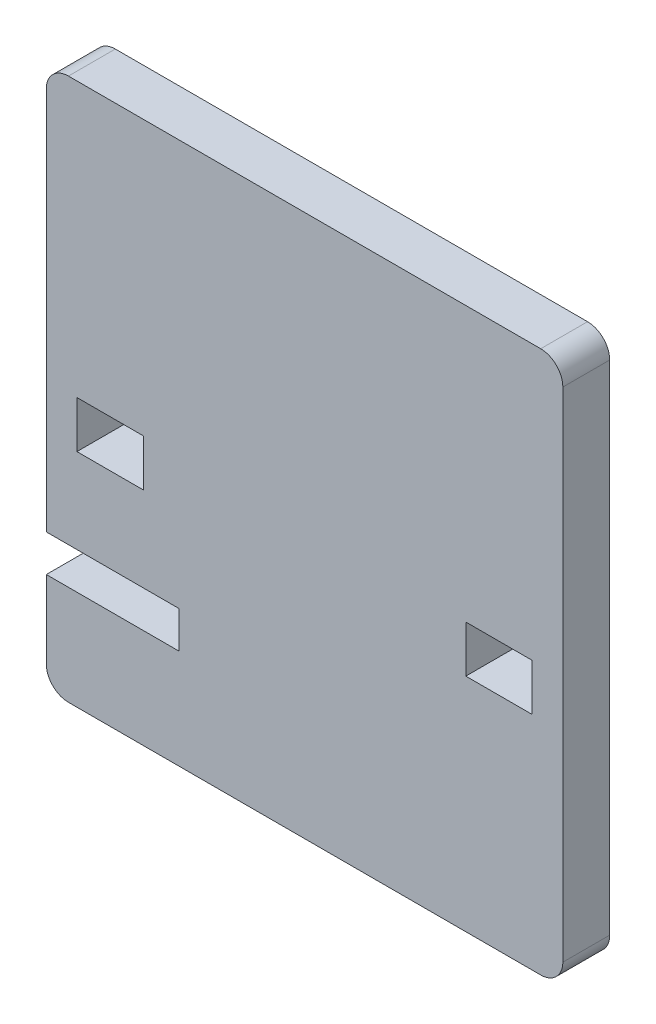
ISO-10303-21;
HEADER;
FILE_DESCRIPTION(('STEP AP214'),'2;1');
FILE_NAME('part.step','',(''),(''),'','','');
FILE_SCHEMA(('AUTOMOTIVE_DESIGN { 1 0 10303 214 1 1 1 1 }'));
ENDSEC;
DATA;
#1=APPLICATION_CONTEXT('core data for automotive mechanical design processes');
#2=APPLICATION_PROTOCOL_DEFINITION('international standard','automotive_design',2000,#1);
#3=PRODUCT_CONTEXT('',#1,'mechanical');
#4=PRODUCT('Part','Part','',(#3));
#5=PRODUCT_RELATED_PRODUCT_CATEGORY('part','',(#4));
#6=PRODUCT_DEFINITION_FORMATION('','',#4);
#7=PRODUCT_DEFINITION_CONTEXT('part definition',#1,'design');
#8=PRODUCT_DEFINITION('design','',#6,#7);
#9=PRODUCT_DEFINITION_SHAPE('','',#8);
#10=(LENGTH_UNIT() NAMED_UNIT(*) SI_UNIT(.MILLI.,.METRE.));
#11=(NAMED_UNIT(*) PLANE_ANGLE_UNIT() SI_UNIT($,.RADIAN.));
#12=(NAMED_UNIT(*) SI_UNIT($,.STERADIAN.) SOLID_ANGLE_UNIT());
#13=UNCERTAINTY_MEASURE_WITH_UNIT(LENGTH_MEASURE(1.E-05),#10,'distance_accuracy_value','');
#14=(GEOMETRIC_REPRESENTATION_CONTEXT(3) GLOBAL_UNCERTAINTY_ASSIGNED_CONTEXT((#13)) GLOBAL_UNIT_ASSIGNED_CONTEXT((#10,
#11,#12)) REPRESENTATION_CONTEXT('',''));
#15=CARTESIAN_POINT('',(0.,0.,0.));
#16=DIRECTION('',(0.,0.,1.));
#17=DIRECTION('',(1.,0.,0.));
#18=AXIS2_PLACEMENT_3D('',#15,#16,#17);
#19=CARTESIAN_POINT('',(-35.,36.75,6.35));
#20=DIRECTION('',(1.,0.,0.));
#21=DIRECTION('',(0.,0.,-1.));
#22=AXIS2_PLACEMENT_3D('',#19,#20,#21);
#23=PLANE('',#22);
#24=DIRECTION('',(0.,-1.,0.));
#25=VECTOR('',#24,1.);
#26=CARTESIAN_POINT('',(-35.,36.75,0.));
#27=LINE('',#26,#25);
#28=CARTESIAN_POINT('',(-35.,-23.25,0.));
#29=VERTEX_POINT('',#28);
#30=CARTESIAN_POINT('',(-35.,-33.75,0.));
#31=VERTEX_POINT('',#30);
#32=EDGE_CURVE('E293',#29,#31,#27,.T.);
#33=ORIENTED_EDGE('',*,*,#32,.T.);
#34=DIRECTION('',(0.,0.,-1.));
#35=VECTOR('',#34,1.);
#36=CARTESIAN_POINT('',(-35.,-33.75,6.35));
#37=LINE('',#36,#35);
#38=CARTESIAN_POINT('',(-35.,-33.75,6.35));
#39=VERTEX_POINT('',#38);
#40=EDGE_CURVE('E310',#31,#39,#37,.F.);
#41=ORIENTED_EDGE('',*,*,#40,.T.);
#42=DIRECTION('',(0.,-1.,0.));
#43=VECTOR('',#42,1.);
#44=CARTESIAN_POINT('',(-35.,36.75,6.35));
#45=LINE('',#44,#43);
#46=CARTESIAN_POINT('',(-35.,-23.25,6.35));
#47=VERTEX_POINT('',#46);
#48=EDGE_CURVE('E282',#47,#39,#45,.T.);
#49=ORIENTED_EDGE('',*,*,#48,.F.);
#50=DIRECTION('',(0.,0.,1.));
#51=VECTOR('',#50,1.);
#52=CARTESIAN_POINT('',(-35.,-23.25,0.));
#53=LINE('',#52,#51);
#54=EDGE_CURVE('E209',#29,#47,#53,.T.);
#55=ORIENTED_EDGE('',*,*,#54,.F.);
#56=EDGE_LOOP('',(#33,#41,#49,#55));
#57=FACE_BOUND('',#56,.T.);
#58=ADVANCED_FACE('F33',(#57),#23,.F.);
#59=CARTESIAN_POINT('',(35.,36.75,6.35));
#60=DIRECTION('',(-1.,0.,0.));
#61=DIRECTION('',(0.,0.,1.));
#62=AXIS2_PLACEMENT_3D('',#59,#60,#61);
#63=PLANE('',#62);
#64=DIRECTION('',(0.,1.,0.));
#65=VECTOR('',#64,1.);
#66=CARTESIAN_POINT('',(35.,36.75,6.35));
#67=LINE('',#66,#65);
#68=CARTESIAN_POINT('',(35.,-33.75,6.35));
#69=VERTEX_POINT('',#68);
#70=CARTESIAN_POINT('',(35.,33.75,6.35));
#71=VERTEX_POINT('',#70);
#72=EDGE_CURVE('E276',#69,#71,#67,.T.);
#73=ORIENTED_EDGE('',*,*,#72,.F.);
#74=DIRECTION('',(0.,0.,-1.));
#75=VECTOR('',#74,1.);
#76=CARTESIAN_POINT('',(35.,-33.75,6.35));
#77=LINE('',#76,#75);
#78=CARTESIAN_POINT('',(35.,-33.75,0.));
#79=VERTEX_POINT('',#78);
#80=EDGE_CURVE('E321',#69,#79,#77,.T.);
#81=ORIENTED_EDGE('',*,*,#80,.T.);
#82=DIRECTION('',(0.,1.,0.));
#83=VECTOR('',#82,1.);
#84=CARTESIAN_POINT('',(35.,36.75,0.));
#85=LINE('',#84,#83);
#86=CARTESIAN_POINT('',(35.,33.75,0.));
#87=VERTEX_POINT('',#86);
#88=EDGE_CURVE('E269',#79,#87,#85,.T.);
#89=ORIENTED_EDGE('',*,*,#88,.T.);
#90=DIRECTION('',(0.,0.,-1.));
#91=VECTOR('',#90,1.);
#92=CARTESIAN_POINT('',(35.,33.75,6.35));
#93=LINE('',#92,#91);
#94=EDGE_CURVE('E319',#87,#71,#93,.F.);
#95=ORIENTED_EDGE('',*,*,#94,.T.);
#96=EDGE_LOOP('',(#73,#81,#89,#95));
#97=FACE_BOUND('',#96,.T.);
#98=ADVANCED_FACE('F359',(#97),#63,.F.);
#99=CARTESIAN_POINT('',(-35.,36.75,6.35));
#100=DIRECTION('',(0.,-1.,0.));
#101=DIRECTION('',(0.,0.,-1.));
#102=AXIS2_PLACEMENT_3D('',#99,#100,#101);
#103=PLANE('',#102);
#104=DIRECTION('',(-1.,0.,0.));
#105=VECTOR('',#104,1.);
#106=CARTESIAN_POINT('',(-35.,36.75,6.35));
#107=LINE('',#106,#105);
#108=CARTESIAN_POINT('',(32.,36.75,6.35));
#109=VERTEX_POINT('',#108);
#110=CARTESIAN_POINT('',(-32.,36.75,6.35));
#111=VERTEX_POINT('',#110);
#112=EDGE_CURVE('E279',#109,#111,#107,.T.);
#113=ORIENTED_EDGE('',*,*,#112,.F.);
#114=DIRECTION('',(0.,0.,-1.));
#115=VECTOR('',#114,1.);
#116=CARTESIAN_POINT('',(32.,36.75,6.35));
#117=LINE('',#116,#115);
#118=CARTESIAN_POINT('',(32.,36.75,0.));
#119=VERTEX_POINT('',#118);
#120=EDGE_CURVE('E41',#109,#119,#117,.T.);
#121=ORIENTED_EDGE('',*,*,#120,.T.);
#122=DIRECTION('',(-1.,0.,0.));
#123=VECTOR('',#122,1.);
#124=CARTESIAN_POINT('',(-35.,36.75,0.));
#125=LINE('',#124,#123);
#126=CARTESIAN_POINT('',(-32.,36.75,0.));
#127=VERTEX_POINT('',#126);
#128=EDGE_CURVE('E291',#119,#127,#125,.T.);
#129=ORIENTED_EDGE('',*,*,#128,.T.);
#130=DIRECTION('',(0.,0.,-1.));
#131=VECTOR('',#130,1.);
#132=CARTESIAN_POINT('',(-32.,36.75,6.35));
#133=LINE('',#132,#131);
#134=EDGE_CURVE('E56',#127,#111,#133,.F.);
#135=ORIENTED_EDGE('',*,*,#134,.T.);
#136=EDGE_LOOP('',(#113,#121,#129,#135));
#137=FACE_BOUND('',#136,.T.);
#138=ADVANCED_FACE('F327',(#137),#103,.F.);
#139=CARTESIAN_POINT('',(-35.,33.75,6.35));
#140=VERTEX_POINT('',#139);
#141=CARTESIAN_POINT('',(-35.,-18.25,6.35));
#142=VERTEX_POINT('',#141);
#143=EDGE_CURVE('E283',#140,#142,#45,.T.);
#144=ORIENTED_EDGE('',*,*,#143,.F.);
#145=DIRECTION('',(0.,0.,-1.));
#146=VECTOR('',#145,1.);
#147=CARTESIAN_POINT('',(-35.,33.75,6.35));
#148=LINE('',#147,#146);
#149=CARTESIAN_POINT('',(-35.,33.75,0.));
#150=VERTEX_POINT('',#149);
#151=EDGE_CURVE('E11',#140,#150,#148,.T.);
#152=ORIENTED_EDGE('',*,*,#151,.T.);
#153=CARTESIAN_POINT('',(-35.,-18.25,0.));
#154=VERTEX_POINT('',#153);
#155=EDGE_CURVE('E294',#150,#154,#27,.T.);
#156=ORIENTED_EDGE('',*,*,#155,.T.);
#157=DIRECTION('',(0.,0.,1.));
#158=VECTOR('',#157,1.);
#159=CARTESIAN_POINT('',(-35.,-18.25,0.));
#160=LINE('',#159,#158);
#161=EDGE_CURVE('E183',#154,#142,#160,.T.);
#162=ORIENTED_EDGE('',*,*,#161,.T.);
#163=EDGE_LOOP('',(#144,#152,#156,#162));
#164=FACE_BOUND('',#163,.T.);
#165=ADVANCED_FACE('F334',(#164),#23,.F.);
#166=CARTESIAN_POINT('',(-35.,-36.75,6.35));
#167=DIRECTION('',(0.,1.,0.));
#168=DIRECTION('',(0.,0.,1.));
#169=AXIS2_PLACEMENT_3D('',#166,#167,#168);
#170=PLANE('',#169);
#171=DIRECTION('',(1.,0.,0.));
#172=VECTOR('',#171,1.);
#173=CARTESIAN_POINT('',(-35.,-36.75,6.35));
#174=LINE('',#173,#172);
#175=CARTESIAN_POINT('',(-32.,-36.75,6.35));
#176=VERTEX_POINT('',#175);
#177=CARTESIAN_POINT('',(32.,-36.75,6.35));
#178=VERTEX_POINT('',#177);
#179=EDGE_CURVE('E285',#176,#178,#174,.T.);
#180=ORIENTED_EDGE('',*,*,#179,.F.);
#181=DIRECTION('',(0.,0.,-1.));
#182=VECTOR('',#181,1.);
#183=CARTESIAN_POINT('',(-32.,-36.75,6.35));
#184=LINE('',#183,#182);
#185=CARTESIAN_POINT('',(-32.,-36.75,0.));
#186=VERTEX_POINT('',#185);
#187=EDGE_CURVE('E299',#176,#186,#184,.T.);
#188=ORIENTED_EDGE('',*,*,#187,.T.);
#189=DIRECTION('',(1.,0.,0.));
#190=VECTOR('',#189,1.);
#191=CARTESIAN_POINT('',(-35.,-36.75,0.));
#192=LINE('',#191,#190);
#193=CARTESIAN_POINT('',(32.,-36.75,0.));
#194=VERTEX_POINT('',#193);
#195=EDGE_CURVE('E280',#186,#194,#192,.T.);
#196=ORIENTED_EDGE('',*,*,#195,.T.);
#197=DIRECTION('',(0.,0.,-1.));
#198=VECTOR('',#197,1.);
#199=CARTESIAN_POINT('',(32.,-36.75,6.35));
#200=LINE('',#199,#198);
#201=EDGE_CURVE('E288',#194,#178,#200,.F.);
#202=ORIENTED_EDGE('',*,*,#201,.T.);
#203=EDGE_LOOP('',(#180,#188,#196,#202));
#204=FACE_BOUND('',#203,.T.);
#205=ADVANCED_FACE('F352',(#204),#170,.F.);
#206=CARTESIAN_POINT('',(0.,0.,6.35));
#207=DIRECTION('',(0.,0.,1.));
#208=DIRECTION('',(1.,0.,0.));
#209=AXIS2_PLACEMENT_3D('',#206,#207,#208);
#210=PLANE('',#209);
#211=ORIENTED_EDGE('',*,*,#48,.T.);
#212=CARTESIAN_POINT('',(-32.,-33.75,6.35));
#213=DIRECTION('',(0.,0.,1.));
#214=DIRECTION('',(1.,0.,0.));
#215=AXIS2_PLACEMENT_3D('',#212,#213,#214);
#216=CIRCLE('',#215,3.);
#217=EDGE_CURVE('E317',#39,#176,#216,.T.);
#218=ORIENTED_EDGE('',*,*,#217,.T.);
#219=ORIENTED_EDGE('',*,*,#179,.T.);
#220=CARTESIAN_POINT('',(32.,-33.75,6.35));
#221=DIRECTION('',(0.,0.,1.));
#222=DIRECTION('',(1.,0.,0.));
#223=AXIS2_PLACEMENT_3D('',#220,#221,#222);
#224=CIRCLE('',#223,3.);
#225=EDGE_CURVE('E315',#178,#69,#224,.T.);
#226=ORIENTED_EDGE('',*,*,#225,.T.);
#227=ORIENTED_EDGE('',*,*,#72,.T.);
#228=CARTESIAN_POINT('',(32.,33.75,6.35));
#229=DIRECTION('',(0.,0.,1.));
#230=DIRECTION('',(1.,0.,0.));
#231=AXIS2_PLACEMENT_3D('',#228,#229,#230);
#232=CIRCLE('',#231,3.);
#233=EDGE_CURVE('E313',#71,#109,#232,.T.);
#234=ORIENTED_EDGE('',*,*,#233,.T.);
#235=ORIENTED_EDGE('',*,*,#112,.T.);
#236=CARTESIAN_POINT('',(-32.,33.75,6.35));
#237=DIRECTION('',(0.,0.,1.));
#238=DIRECTION('',(1.,0.,0.));
#239=AXIS2_PLACEMENT_3D('',#236,#237,#238);
#240=CIRCLE('',#239,3.);
#241=EDGE_CURVE('E48',#111,#140,#240,.T.);
#242=ORIENTED_EDGE('',*,*,#241,.T.);
#243=ORIENTED_EDGE('',*,*,#143,.T.);
#244=DIRECTION('',(-1.,0.,0.));
#245=VECTOR('',#244,1.);
#246=CARTESIAN_POINT('',(-35.,-18.25,6.35));
#247=LINE('',#246,#245);
#248=CARTESIAN_POINT('',(-17.0079674,-18.25,6.35));
#249=VERTEX_POINT('',#248);
#250=EDGE_CURVE('E200',#249,#142,#247,.T.);
#251=ORIENTED_EDGE('',*,*,#250,.F.);
#252=DIRECTION('',(0.,1.,0.));
#253=VECTOR('',#252,1.);
#254=CARTESIAN_POINT('',(-17.0079674,-18.25,6.35));
#255=LINE('',#254,#253);
#256=CARTESIAN_POINT('',(-17.0079674,-23.25,6.35));
#257=VERTEX_POINT('',#256);
#258=EDGE_CURVE('E179',#257,#249,#255,.T.);
#259=ORIENTED_EDGE('',*,*,#258,.F.);
#260=DIRECTION('',(1.,0.,0.));
#261=VECTOR('',#260,1.);
#262=CARTESIAN_POINT('',(-35.,-23.25,6.35));
#263=LINE('',#262,#261);
#264=EDGE_CURVE('E197',#47,#257,#263,.T.);
#265=ORIENTED_EDGE('',*,*,#264,.F.);
#266=EDGE_LOOP('',(#211,#218,#219,#226,#227,#234,#235,#242,#243,#251,#259,#265));
#267=FACE_BOUND('',#266,.T.);
#268=DIRECTION('',(-1.,0.,0.));
#269=VECTOR('',#268,1.);
#270=CARTESIAN_POINT('',(30.85,-0.399999999999992,6.35));
#271=LINE('',#270,#269);
#272=CARTESIAN_POINT('',(30.85,-0.399999999999992,6.35));
#273=VERTEX_POINT('',#272);
#274=CARTESIAN_POINT('',(21.85,-0.399999999999994,6.35));
#275=VERTEX_POINT('',#274);
#276=EDGE_CURVE('E208',#273,#275,#271,.T.);
#277=ORIENTED_EDGE('',*,*,#276,.F.);
#278=DIRECTION('',(0.,1.,0.));
#279=VECTOR('',#278,1.);
#280=CARTESIAN_POINT('',(30.85,-0.399999999999992,6.35));
#281=LINE('',#280,#279);
#282=CARTESIAN_POINT('',(30.85,-6.74999999999999,6.35));
#283=VERTEX_POINT('',#282);
#284=EDGE_CURVE('E216',#283,#273,#281,.T.);
#285=ORIENTED_EDGE('',*,*,#284,.F.);
#286=DIRECTION('',(1.,0.,0.));
#287=VECTOR('',#286,1.);
#288=CARTESIAN_POINT('',(30.85,-6.74999999999999,6.35));
#289=LINE('',#288,#287);
#290=CARTESIAN_POINT('',(21.85,-6.74999999999999,6.35));
#291=VERTEX_POINT('',#290);
#292=EDGE_CURVE('E230',#291,#283,#289,.T.);
#293=ORIENTED_EDGE('',*,*,#292,.F.);
#294=DIRECTION('',(0.,-1.,0.));
#295=VECTOR('',#294,1.);
#296=CARTESIAN_POINT('',(21.85,-0.399999999999994,6.35));
#297=LINE('',#296,#295);
#298=EDGE_CURVE('E227',#275,#291,#297,.T.);
#299=ORIENTED_EDGE('',*,*,#298,.F.);
#300=EDGE_LOOP('',(#277,#285,#293,#299));
#301=FACE_BOUND('',#300,.T.);
#302=DIRECTION('',(0.,-1.,0.));
#303=VECTOR('',#302,1.);
#304=CARTESIAN_POINT('',(-30.85,-0.399999999999999,6.35));
#305=LINE('',#304,#303);
#306=CARTESIAN_POINT('',(-30.85,-0.399999999999999,6.35));
#307=VERTEX_POINT('',#306);
#308=CARTESIAN_POINT('',(-30.85,-6.75,6.35));
#309=VERTEX_POINT('',#308);
#310=EDGE_CURVE('E237',#307,#309,#305,.T.);
#311=ORIENTED_EDGE('',*,*,#310,.F.);
#312=DIRECTION('',(-1.,0.,0.));
#313=VECTOR('',#312,1.);
#314=CARTESIAN_POINT('',(-30.85,-0.399999999999999,6.35));
#315=LINE('',#314,#313);
#316=CARTESIAN_POINT('',(-21.85,-0.399999999999999,6.35));
#317=VERTEX_POINT('',#316);
#318=EDGE_CURVE('E248',#317,#307,#315,.T.);
#319=ORIENTED_EDGE('',*,*,#318,.F.);
#320=DIRECTION('',(0.,1.,0.));
#321=VECTOR('',#320,1.);
#322=CARTESIAN_POINT('',(-21.85,-0.399999999999999,6.35));
#323=LINE('',#322,#321);
#324=CARTESIAN_POINT('',(-21.85,-6.75,6.35));
#325=VERTEX_POINT('',#324);
#326=EDGE_CURVE('E262',#325,#317,#323,.T.);
#327=ORIENTED_EDGE('',*,*,#326,.F.);
#328=DIRECTION('',(1.,0.,0.));
#329=VECTOR('',#328,1.);
#330=CARTESIAN_POINT('',(-30.85,-6.75,6.35));
#331=LINE('',#330,#329);
#332=EDGE_CURVE('E259',#309,#325,#331,.T.);
#333=ORIENTED_EDGE('',*,*,#332,.F.);
#334=EDGE_LOOP('',(#311,#319,#327,#333));
#335=FACE_BOUND('',#334,.T.);
#336=ADVANCED_FACE('F336',(#267,#301,#335),#210,.T.);
#337=CARTESIAN_POINT('',(0.,0.,0.));
#338=DIRECTION('',(0.,0.,1.));
#339=DIRECTION('',(1.,0.,0.));
#340=AXIS2_PLACEMENT_3D('',#337,#338,#339);
#341=PLANE('',#340);
#342=DIRECTION('',(0.,1.,0.));
#343=VECTOR('',#342,1.);
#344=CARTESIAN_POINT('',(30.85,-0.399999999999992,0.));
#345=LINE('',#344,#343);
#346=CARTESIAN_POINT('',(30.85,-6.74999999999999,0.));
#347=VERTEX_POINT('',#346);
#348=CARTESIAN_POINT('',(30.85,-0.399999999999992,0.));
#349=VERTEX_POINT('',#348);
#350=EDGE_CURVE('E222',#347,#349,#345,.T.);
#351=ORIENTED_EDGE('',*,*,#350,.T.);
#352=DIRECTION('',(-1.,0.,0.));
#353=VECTOR('',#352,1.);
#354=CARTESIAN_POINT('',(30.85,-0.399999999999992,0.));
#355=LINE('',#354,#353);
#356=CARTESIAN_POINT('',(21.85,-0.399999999999994,0.));
#357=VERTEX_POINT('',#356);
#358=EDGE_CURVE('E212',#349,#357,#355,.T.);
#359=ORIENTED_EDGE('',*,*,#358,.T.);
#360=DIRECTION('',(0.,-1.,0.));
#361=VECTOR('',#360,1.);
#362=CARTESIAN_POINT('',(21.85,-0.399999999999994,0.));
#363=LINE('',#362,#361);
#364=CARTESIAN_POINT('',(21.85,-6.74999999999999,0.));
#365=VERTEX_POINT('',#364);
#366=EDGE_CURVE('E215',#357,#365,#363,.T.);
#367=ORIENTED_EDGE('',*,*,#366,.T.);
#368=DIRECTION('',(1.,0.,0.));
#369=VECTOR('',#368,1.);
#370=CARTESIAN_POINT('',(30.85,-6.74999999999999,0.));
#371=LINE('',#370,#369);
#372=EDGE_CURVE('E219',#365,#347,#371,.T.);
#373=ORIENTED_EDGE('',*,*,#372,.T.);
#374=EDGE_LOOP('',(#351,#359,#367,#373));
#375=FACE_BOUND('',#374,.T.);
#376=DIRECTION('',(-1.,0.,0.));
#377=VECTOR('',#376,1.);
#378=CARTESIAN_POINT('',(-30.85,-0.399999999999999,0.));
#379=LINE('',#378,#377);
#380=CARTESIAN_POINT('',(-21.85,-0.399999999999999,0.));
#381=VERTEX_POINT('',#380);
#382=CARTESIAN_POINT('',(-30.85,-0.399999999999999,0.));
#383=VERTEX_POINT('',#382);
#384=EDGE_CURVE('E254',#381,#383,#379,.T.);
#385=ORIENTED_EDGE('',*,*,#384,.T.);
#386=DIRECTION('',(0.,-1.,0.));
#387=VECTOR('',#386,1.);
#388=CARTESIAN_POINT('',(-30.85,-0.399999999999999,0.));
#389=LINE('',#388,#387);
#390=CARTESIAN_POINT('',(-30.85,-6.75,0.));
#391=VERTEX_POINT('',#390);
#392=EDGE_CURVE('E244',#383,#391,#389,.T.);
#393=ORIENTED_EDGE('',*,*,#392,.T.);
#394=DIRECTION('',(1.,0.,0.));
#395=VECTOR('',#394,1.);
#396=CARTESIAN_POINT('',(-30.85,-6.75,0.));
#397=LINE('',#396,#395);
#398=CARTESIAN_POINT('',(-21.85,-6.75,0.));
#399=VERTEX_POINT('',#398);
#400=EDGE_CURVE('E247',#391,#399,#397,.T.);
#401=ORIENTED_EDGE('',*,*,#400,.T.);
#402=DIRECTION('',(0.,1.,0.));
#403=VECTOR('',#402,1.);
#404=CARTESIAN_POINT('',(-21.85,-0.399999999999999,0.));
#405=LINE('',#404,#403);
#406=EDGE_CURVE('E251',#399,#381,#405,.T.);
#407=ORIENTED_EDGE('',*,*,#406,.T.);
#408=EDGE_LOOP('',(#385,#393,#401,#407));
#409=FACE_BOUND('',#408,.T.);
#410=ORIENTED_EDGE('',*,*,#195,.F.);
#411=CARTESIAN_POINT('',(-32.,-33.75,0.));
#412=DIRECTION('',(0.,0.,1.));
#413=DIRECTION('',(1.,0.,0.));
#414=AXIS2_PLACEMENT_3D('',#411,#412,#413);
#415=CIRCLE('',#414,3.);
#416=EDGE_CURVE('E308',#186,#31,#415,.F.);
#417=ORIENTED_EDGE('',*,*,#416,.T.);
#418=ORIENTED_EDGE('',*,*,#32,.F.);
#419=DIRECTION('',(1.,0.,0.));
#420=VECTOR('',#419,1.);
#421=CARTESIAN_POINT('',(-35.,-23.25,0.));
#422=LINE('',#421,#420);
#423=CARTESIAN_POINT('',(-17.0079674,-23.25,0.));
#424=VERTEX_POINT('',#423);
#425=EDGE_CURVE('E184',#29,#424,#422,.T.);
#426=ORIENTED_EDGE('',*,*,#425,.T.);
#427=DIRECTION('',(0.,1.,0.));
#428=VECTOR('',#427,1.);
#429=CARTESIAN_POINT('',(-17.0079674,-18.25,0.));
#430=LINE('',#429,#428);
#431=CARTESIAN_POINT('',(-17.0079674,-18.25,0.));
#432=VERTEX_POINT('',#431);
#433=EDGE_CURVE('E176',#424,#432,#430,.T.);
#434=ORIENTED_EDGE('',*,*,#433,.T.);
#435=DIRECTION('',(-1.,0.,0.));
#436=VECTOR('',#435,1.);
#437=CARTESIAN_POINT('',(-35.,-18.25,0.));
#438=LINE('',#437,#436);
#439=EDGE_CURVE('E188',#432,#154,#438,.T.);
#440=ORIENTED_EDGE('',*,*,#439,.T.);
#441=ORIENTED_EDGE('',*,*,#155,.F.);
#442=CARTESIAN_POINT('',(-32.,33.75,0.));
#443=DIRECTION('',(0.,0.,1.));
#444=DIRECTION('',(1.,0.,0.));
#445=AXIS2_PLACEMENT_3D('',#442,#443,#444);
#446=CIRCLE('',#445,3.);
#447=EDGE_CURVE('E302',#150,#127,#446,.F.);
#448=ORIENTED_EDGE('',*,*,#447,.T.);
#449=ORIENTED_EDGE('',*,*,#128,.F.);
#450=CARTESIAN_POINT('',(32.,33.75,0.));
#451=DIRECTION('',(0.,0.,1.));
#452=DIRECTION('',(1.,0.,0.));
#453=AXIS2_PLACEMENT_3D('',#450,#451,#452);
#454=CIRCLE('',#453,3.);
#455=EDGE_CURVE('E304',#119,#87,#454,.F.);
#456=ORIENTED_EDGE('',*,*,#455,.T.);
#457=ORIENTED_EDGE('',*,*,#88,.F.);
#458=CARTESIAN_POINT('',(32.,-33.75,0.));
#459=DIRECTION('',(0.,0.,1.));
#460=DIRECTION('',(1.,0.,0.));
#461=AXIS2_PLACEMENT_3D('',#458,#459,#460);
#462=CIRCLE('',#461,3.);
#463=EDGE_CURVE('E306',#79,#194,#462,.F.);
#464=ORIENTED_EDGE('',*,*,#463,.T.);
#465=EDGE_LOOP('',(#410,#417,#418,#426,#434,#440,#441,#448,#449,#456,#457,#464));
#466=FACE_BOUND('',#465,.T.);
#467=ADVANCED_FACE('F195',(#375,#409,#466),#341,.F.);
#468=CARTESIAN_POINT('',(-30.85,-0.399999999999999,0.));
#469=DIRECTION('',(-1.,0.,0.));
#470=DIRECTION('',(0.,0.,1.));
#471=AXIS2_PLACEMENT_3D('',#468,#469,#470);
#472=PLANE('',#471);
#473=ORIENTED_EDGE('',*,*,#310,.T.);
#474=DIRECTION('',(0.,0.,1.));
#475=VECTOR('',#474,1.);
#476=CARTESIAN_POINT('',(-30.85,-6.75,0.));
#477=LINE('',#476,#475);
#478=EDGE_CURVE('E257',#391,#309,#477,.T.);
#479=ORIENTED_EDGE('',*,*,#478,.F.);
#480=ORIENTED_EDGE('',*,*,#392,.F.);
#481=DIRECTION('',(0.,0.,1.));
#482=VECTOR('',#481,1.);
#483=CARTESIAN_POINT('',(-30.85,-0.399999999999999,0.));
#484=LINE('',#483,#482);
#485=EDGE_CURVE('E267',#383,#307,#484,.T.);
#486=ORIENTED_EDGE('',*,*,#485,.T.);
#487=EDGE_LOOP('',(#473,#479,#480,#486));
#488=FACE_BOUND('',#487,.T.);
#489=ADVANCED_FACE('F418',(#488),#472,.F.);
#490=CARTESIAN_POINT('',(-30.85,-0.399999999999999,0.));
#491=DIRECTION('',(0.,1.,0.));
#492=DIRECTION('',(0.,0.,1.));
#493=AXIS2_PLACEMENT_3D('',#490,#491,#492);
#494=PLANE('',#493);
#495=ORIENTED_EDGE('',*,*,#318,.T.);
#496=ORIENTED_EDGE('',*,*,#485,.F.);
#497=ORIENTED_EDGE('',*,*,#384,.F.);
#498=DIRECTION('',(0.,0.,1.));
#499=VECTOR('',#498,1.);
#500=CARTESIAN_POINT('',(-21.85,-0.399999999999999,0.));
#501=LINE('',#500,#499);
#502=EDGE_CURVE('E270',#381,#317,#501,.T.);
#503=ORIENTED_EDGE('',*,*,#502,.T.);
#504=EDGE_LOOP('',(#495,#496,#497,#503));
#505=FACE_BOUND('',#504,.T.);
#506=ADVANCED_FACE('F414',(#505),#494,.F.);
#507=CARTESIAN_POINT('',(-21.85,-0.399999999999999,0.));
#508=DIRECTION('',(1.,0.,0.));
#509=DIRECTION('',(0.,0.,-1.));
#510=AXIS2_PLACEMENT_3D('',#507,#508,#509);
#511=PLANE('',#510);
#512=ORIENTED_EDGE('',*,*,#326,.T.);
#513=ORIENTED_EDGE('',*,*,#502,.F.);
#514=ORIENTED_EDGE('',*,*,#406,.F.);
#515=DIRECTION('',(0.,0.,1.));
#516=VECTOR('',#515,1.);
#517=CARTESIAN_POINT('',(-21.85,-6.75,0.));
#518=LINE('',#517,#516);
#519=EDGE_CURVE('E272',#399,#325,#518,.T.);
#520=ORIENTED_EDGE('',*,*,#519,.T.);
#521=EDGE_LOOP('',(#512,#513,#514,#520));
#522=FACE_BOUND('',#521,.T.);
#523=ADVANCED_FACE('F417',(#522),#511,.F.);
#524=CARTESIAN_POINT('',(-30.85,-6.75,0.));
#525=DIRECTION('',(0.,-1.,0.));
#526=DIRECTION('',(0.,0.,-1.));
#527=AXIS2_PLACEMENT_3D('',#524,#525,#526);
#528=PLANE('',#527);
#529=ORIENTED_EDGE('',*,*,#332,.T.);
#530=ORIENTED_EDGE('',*,*,#519,.F.);
#531=ORIENTED_EDGE('',*,*,#400,.F.);
#532=ORIENTED_EDGE('',*,*,#478,.T.);
#533=EDGE_LOOP('',(#529,#530,#531,#532));
#534=FACE_BOUND('',#533,.T.);
#535=ADVANCED_FACE('F412',(#534),#528,.F.);
#536=CARTESIAN_POINT('',(30.85,-0.399999999999992,0.));
#537=DIRECTION('',(0.,1.,0.));
#538=DIRECTION('',(-1.,0.,0.));
#539=AXIS2_PLACEMENT_3D('',#536,#537,#538);
#540=PLANE('',#539);
#541=ORIENTED_EDGE('',*,*,#276,.T.);
#542=DIRECTION('',(0.,0.,1.));
#543=VECTOR('',#542,1.);
#544=CARTESIAN_POINT('',(21.85,-0.399999999999994,0.));
#545=LINE('',#544,#543);
#546=EDGE_CURVE('E225',#357,#275,#545,.T.);
#547=ORIENTED_EDGE('',*,*,#546,.F.);
#548=ORIENTED_EDGE('',*,*,#358,.F.);
#549=DIRECTION('',(0.,0.,1.));
#550=VECTOR('',#549,1.);
#551=CARTESIAN_POINT('',(30.85,-0.399999999999992,0.));
#552=LINE('',#551,#550);
#553=EDGE_CURVE('E235',#349,#273,#552,.T.);
#554=ORIENTED_EDGE('',*,*,#553,.T.);
#555=EDGE_LOOP('',(#541,#547,#548,#554));
#556=FACE_BOUND('',#555,.T.);
#557=ADVANCED_FACE('F402',(#556),#540,.F.);
#558=CARTESIAN_POINT('',(30.85,-0.399999999999992,0.));
#559=DIRECTION('',(1.,0.,0.));
#560=DIRECTION('',(0.,0.,-1.));
#561=AXIS2_PLACEMENT_3D('',#558,#559,#560);
#562=PLANE('',#561);
#563=ORIENTED_EDGE('',*,*,#284,.T.);
#564=ORIENTED_EDGE('',*,*,#553,.F.);
#565=ORIENTED_EDGE('',*,*,#350,.F.);
#566=DIRECTION('',(0.,0.,1.));
#567=VECTOR('',#566,1.);
#568=CARTESIAN_POINT('',(30.85,-6.74999999999999,0.));
#569=LINE('',#568,#567);
#570=EDGE_CURVE('E238',#347,#283,#569,.T.);
#571=ORIENTED_EDGE('',*,*,#570,.T.);
#572=EDGE_LOOP('',(#563,#564,#565,#571));
#573=FACE_BOUND('',#572,.T.);
#574=ADVANCED_FACE('F398',(#573),#562,.F.);
#575=CARTESIAN_POINT('',(30.85,-6.74999999999999,0.));
#576=DIRECTION('',(0.,-1.,0.));
#577=DIRECTION('',(1.,0.,0.));
#578=AXIS2_PLACEMENT_3D('',#575,#576,#577);
#579=PLANE('',#578);
#580=ORIENTED_EDGE('',*,*,#292,.T.);
#581=ORIENTED_EDGE('',*,*,#570,.F.);
#582=ORIENTED_EDGE('',*,*,#372,.F.);
#583=DIRECTION('',(0.,0.,1.));
#584=VECTOR('',#583,1.);
#585=CARTESIAN_POINT('',(21.85,-6.74999999999999,0.));
#586=LINE('',#585,#584);
#587=EDGE_CURVE('E240',#365,#291,#586,.T.);
#588=ORIENTED_EDGE('',*,*,#587,.T.);
#589=EDGE_LOOP('',(#580,#581,#582,#588));
#590=FACE_BOUND('',#589,.T.);
#591=ADVANCED_FACE('F401',(#590),#579,.F.);
#592=CARTESIAN_POINT('',(21.85,-0.399999999999994,0.));
#593=DIRECTION('',(-1.,0.,0.));
#594=DIRECTION('',(0.,0.,1.));
#595=AXIS2_PLACEMENT_3D('',#592,#593,#594);
#596=PLANE('',#595);
#597=ORIENTED_EDGE('',*,*,#298,.T.);
#598=ORIENTED_EDGE('',*,*,#587,.F.);
#599=ORIENTED_EDGE('',*,*,#366,.F.);
#600=ORIENTED_EDGE('',*,*,#546,.T.);
#601=EDGE_LOOP('',(#597,#598,#599,#600));
#602=FACE_BOUND('',#601,.T.);
#603=ADVANCED_FACE('F397',(#602),#596,.F.);
#604=CARTESIAN_POINT('',(-17.0079674,-18.25,0.));
#605=DIRECTION('',(1.,0.,0.));
#606=DIRECTION('',(0.,0.,-1.));
#607=AXIS2_PLACEMENT_3D('',#604,#605,#606);
#608=PLANE('',#607);
#609=ORIENTED_EDGE('',*,*,#258,.T.);
#610=DIRECTION('',(0.,0.,1.));
#611=VECTOR('',#610,1.);
#612=CARTESIAN_POINT('',(-17.0079674,-18.25,0.));
#613=LINE('',#612,#611);
#614=EDGE_CURVE('E172',#432,#249,#613,.T.);
#615=ORIENTED_EDGE('',*,*,#614,.F.);
#616=ORIENTED_EDGE('',*,*,#433,.F.);
#617=DIRECTION('',(0.,0.,1.));
#618=VECTOR('',#617,1.);
#619=CARTESIAN_POINT('',(-17.0079674,-23.25,0.));
#620=LINE('',#619,#618);
#621=EDGE_CURVE('E206',#424,#257,#620,.T.);
#622=ORIENTED_EDGE('',*,*,#621,.T.);
#623=EDGE_LOOP('',(#609,#615,#616,#622));
#624=FACE_BOUND('',#623,.T.);
#625=ADVANCED_FACE('F174',(#624),#608,.F.);
#626=CARTESIAN_POINT('',(-35.,-23.25,0.));
#627=DIRECTION('',(0.,-1.,0.));
#628=DIRECTION('',(1.,0.,0.));
#629=AXIS2_PLACEMENT_3D('',#626,#627,#628);
#630=PLANE('',#629);
#631=ORIENTED_EDGE('',*,*,#264,.T.);
#632=ORIENTED_EDGE('',*,*,#621,.F.);
#633=ORIENTED_EDGE('',*,*,#425,.F.);
#634=ORIENTED_EDGE('',*,*,#54,.T.);
#635=EDGE_LOOP('',(#631,#632,#633,#634));
#636=FACE_BOUND('',#635,.T.);
#637=ADVANCED_FACE('F389',(#636),#630,.F.);
#638=CARTESIAN_POINT('',(-35.,-18.25,0.));
#639=DIRECTION('',(0.,1.,0.));
#640=DIRECTION('',(0.,0.,1.));
#641=AXIS2_PLACEMENT_3D('',#638,#639,#640);
#642=PLANE('',#641);
#643=ORIENTED_EDGE('',*,*,#250,.T.);
#644=ORIENTED_EDGE('',*,*,#161,.F.);
#645=ORIENTED_EDGE('',*,*,#439,.F.);
#646=ORIENTED_EDGE('',*,*,#614,.T.);
#647=EDGE_LOOP('',(#643,#644,#645,#646));
#648=FACE_BOUND('',#647,.T.);
#649=ADVANCED_FACE('F189',(#648),#642,.F.);
#650=CARTESIAN_POINT('',(-32.,-33.75,6.35));
#651=DIRECTION('',(0.,0.,-1.));
#652=DIRECTION('',(-1.,0.,0.));
#653=AXIS2_PLACEMENT_3D('',#650,#651,#652);
#654=CYLINDRICAL_SURFACE('',#653,3.);
#655=ORIENTED_EDGE('',*,*,#217,.F.);
#656=ORIENTED_EDGE('',*,*,#40,.F.);
#657=ORIENTED_EDGE('',*,*,#416,.F.);
#658=ORIENTED_EDGE('',*,*,#187,.F.);
#659=EDGE_LOOP('',(#655,#656,#657,#658));
#660=FACE_BOUND('',#659,.T.);
#661=ADVANCED_FACE('F347',(#660),#654,.T.);
#662=CARTESIAN_POINT('',(32.,-33.75,6.35));
#663=DIRECTION('',(0.,0.,-1.));
#664=DIRECTION('',(-1.,0.,0.));
#665=AXIS2_PLACEMENT_3D('',#662,#663,#664);
#666=CYLINDRICAL_SURFACE('',#665,3.);
#667=ORIENTED_EDGE('',*,*,#225,.F.);
#668=ORIENTED_EDGE('',*,*,#201,.F.);
#669=ORIENTED_EDGE('',*,*,#463,.F.);
#670=ORIENTED_EDGE('',*,*,#80,.F.);
#671=EDGE_LOOP('',(#667,#668,#669,#670));
#672=FACE_BOUND('',#671,.T.);
#673=ADVANCED_FACE('F355',(#672),#666,.T.);
#674=CARTESIAN_POINT('',(32.,33.75,6.35));
#675=DIRECTION('',(0.,0.,-1.));
#676=DIRECTION('',(-1.,0.,0.));
#677=AXIS2_PLACEMENT_3D('',#674,#675,#676);
#678=CYLINDRICAL_SURFACE('',#677,3.);
#679=ORIENTED_EDGE('',*,*,#233,.F.);
#680=ORIENTED_EDGE('',*,*,#94,.F.);
#681=ORIENTED_EDGE('',*,*,#455,.F.);
#682=ORIENTED_EDGE('',*,*,#120,.F.);
#683=EDGE_LOOP('',(#679,#680,#681,#682));
#684=FACE_BOUND('',#683,.T.);
#685=ADVANCED_FACE('F361',(#684),#678,.T.);
#686=CARTESIAN_POINT('',(-32.,33.75,6.35));
#687=DIRECTION('',(0.,0.,-1.));
#688=DIRECTION('',(-1.,0.,0.));
#689=AXIS2_PLACEMENT_3D('',#686,#687,#688);
#690=CYLINDRICAL_SURFACE('',#689,3.);
#691=ORIENTED_EDGE('',*,*,#241,.F.);
#692=ORIENTED_EDGE('',*,*,#134,.F.);
#693=ORIENTED_EDGE('',*,*,#447,.F.);
#694=ORIENTED_EDGE('',*,*,#151,.F.);
#695=EDGE_LOOP('',(#691,#692,#693,#694));
#696=FACE_BOUND('',#695,.T.);
#697=ADVANCED_FACE('F35',(#696),#690,.T.);
#698=CLOSED_SHELL('',(#58,#98,#138,#165,#205,#336,#467,#489,#506,#523,#535,#557,#574,#591,#603,
#625,#637,#649,#661,#673,#685,#697));
#699=MANIFOLD_SOLID_BREP('B2',#698);
#700=ADVANCED_BREP_SHAPE_REPRESENTATION('',(#18,#699),#14);
#701=SHAPE_DEFINITION_REPRESENTATION(#9,#700);
ENDSEC;
END-ISO-10303-21;
